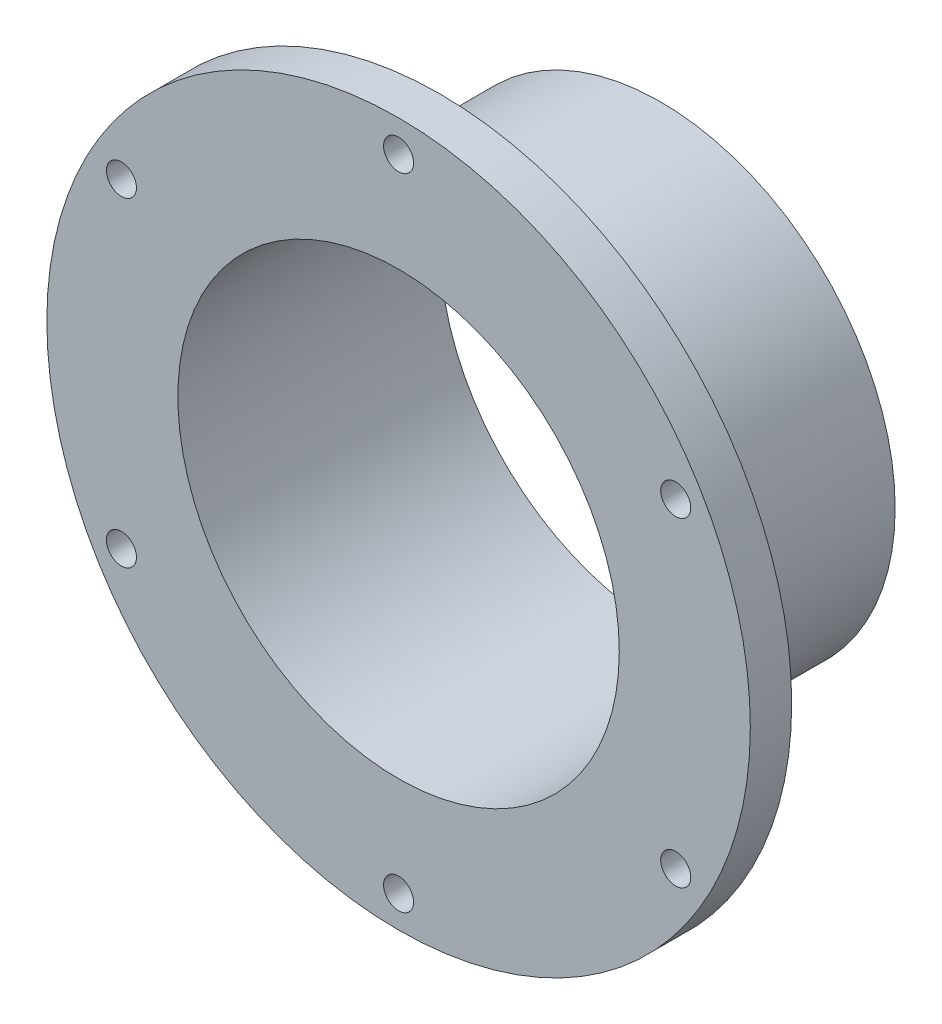
ISO-10303-21;
HEADER;
FILE_DESCRIPTION(('STEP AP214'),'2;1');
FILE_NAME('part.step','',(''),(''),'','','');
FILE_SCHEMA(('AUTOMOTIVE_DESIGN { 1 0 10303 214 1 1 1 1 }'));
ENDSEC;
DATA;
#1=APPLICATION_CONTEXT('core data for automotive mechanical design processes');
#2=APPLICATION_PROTOCOL_DEFINITION('international standard','automotive_design',2000,#1);
#3=PRODUCT_CONTEXT('',#1,'mechanical');
#4=PRODUCT('Part','Part','',(#3));
#5=PRODUCT_RELATED_PRODUCT_CATEGORY('part','',(#4));
#6=PRODUCT_DEFINITION_FORMATION('','',#4);
#7=PRODUCT_DEFINITION_CONTEXT('part definition',#1,'design');
#8=PRODUCT_DEFINITION('design','',#6,#7);
#9=PRODUCT_DEFINITION_SHAPE('','',#8);
#10=(LENGTH_UNIT() NAMED_UNIT(*) SI_UNIT(.MILLI.,.METRE.));
#11=(NAMED_UNIT(*) PLANE_ANGLE_UNIT() SI_UNIT($,.RADIAN.));
#12=(NAMED_UNIT(*) SI_UNIT($,.STERADIAN.) SOLID_ANGLE_UNIT());
#13=UNCERTAINTY_MEASURE_WITH_UNIT(LENGTH_MEASURE(1.E-05),#10,'distance_accuracy_value','');
#14=(GEOMETRIC_REPRESENTATION_CONTEXT(3) GLOBAL_UNCERTAINTY_ASSIGNED_CONTEXT((#13)) GLOBAL_UNIT_ASSIGNED_CONTEXT((#10,
#11,#12)) REPRESENTATION_CONTEXT('',''));
#15=CARTESIAN_POINT('',(0.,0.,0.));
#16=DIRECTION('',(0.,0.,1.));
#17=DIRECTION('',(1.,0.,0.));
#18=AXIS2_PLACEMENT_3D('',#15,#16,#17);
#19=CARTESIAN_POINT('',(0.,0.,0.));
#20=DIRECTION('',(0.,0.,1.));
#21=DIRECTION('',(1.,0.,0.));
#22=AXIS2_PLACEMENT_3D('',#19,#20,#21);
#23=PLANE('',#22);
#24=CARTESIAN_POINT('',(0.,0.,0.));
#25=DIRECTION('',(0.,0.,1.));
#26=DIRECTION('',(1.,0.,0.));
#27=AXIS2_PLACEMENT_3D('',#24,#25,#26);
#28=CIRCLE('',#27,26.9875);
#29=CARTESIAN_POINT('',(26.9875,0.,0.));
#30=VERTEX_POINT('',#29);
#31=EDGE_CURVE('E44',#30,#30,#28,.T.);
#32=ORIENTED_EDGE('',*,*,#31,.F.);
#33=EDGE_LOOP('',(#32));
#34=FACE_BOUND('',#33,.T.);
#35=CARTESIAN_POINT('',(0.,0.,0.));
#36=DIRECTION('',(0.,0.,1.));
#37=DIRECTION('',(1.,0.,0.));
#38=AXIS2_PLACEMENT_3D('',#35,#36,#37);
#39=CIRCLE('',#38,25.4);
#40=CARTESIAN_POINT('',(25.4,0.,0.));
#41=VERTEX_POINT('',#40);
#42=EDGE_CURVE('E48',#41,#41,#39,.T.);
#43=ORIENTED_EDGE('',*,*,#42,.T.);
#44=EDGE_LOOP('',(#43));
#45=FACE_BOUND('',#44,.T.);
#46=ADVANCED_FACE('F33',(#34,#45),#23,.F.);
#47=CARTESIAN_POINT('',(0.,0.,25.4));
#48=DIRECTION('',(0.,0.,-1.));
#49=DIRECTION('',(-1.,0.,0.));
#50=AXIS2_PLACEMENT_3D('',#47,#48,#49);
#51=CYLINDRICAL_SURFACE('',#50,26.9875);
#52=CARTESIAN_POINT('',(0.,0.,20.32));
#53=DIRECTION('',(0.,0.,1.));
#54=DIRECTION('',(1.,0.,0.));
#55=AXIS2_PLACEMENT_3D('',#52,#53,#54);
#56=CIRCLE('',#55,26.9875);
#57=CARTESIAN_POINT('',(26.9875,0.,20.32));
#58=VERTEX_POINT('',#57);
#59=EDGE_CURVE('E10',#58,#58,#56,.F.);
#60=ORIENTED_EDGE('',*,*,#59,.T.);
#61=EDGE_LOOP('',(#60));
#62=FACE_BOUND('',#61,.T.);
#63=ORIENTED_EDGE('',*,*,#31,.T.);
#64=EDGE_LOOP('',(#63));
#65=FACE_BOUND('',#64,.T.);
#66=ADVANCED_FACE('F124',(#62,#65),#51,.T.);
#67=CARTESIAN_POINT('',(0.,0.,25.4));
#68=DIRECTION('',(0.,0.,-1.));
#69=DIRECTION('',(-1.,0.,0.));
#70=AXIS2_PLACEMENT_3D('',#67,#68,#69);
#71=CYLINDRICAL_SURFACE('',#70,25.4);
#72=ORIENTED_EDGE('',*,*,#42,.F.);
#73=EDGE_LOOP('',(#72));
#74=FACE_BOUND('',#73,.T.);
#75=CARTESIAN_POINT('',(0.,0.,30.1625));
#76=DIRECTION('',(0.,0.,1.));
#77=DIRECTION('',(1.,0.,0.));
#78=AXIS2_PLACEMENT_3D('',#75,#76,#77);
#79=CIRCLE('',#78,25.4);
#80=CARTESIAN_POINT('',(25.4,0.,30.1625));
#81=VERTEX_POINT('',#80);
#82=EDGE_CURVE('E57',#81,#81,#79,.T.);
#83=ORIENTED_EDGE('',*,*,#82,.T.);
#84=EDGE_LOOP('',(#83));
#85=FACE_BOUND('',#84,.T.);
#86=ADVANCED_FACE('F122',(#74,#85),#71,.F.);
#87=CARTESIAN_POINT('',(0.,0.,25.4));
#88=DIRECTION('',(0.,0.,1.));
#89=DIRECTION('',(1.,0.,0.));
#90=AXIS2_PLACEMENT_3D('',#87,#88,#89);
#91=PLANE('',#90);
#92=CARTESIAN_POINT('',(31.8957156213807,18.4150000000004,25.4));
#93=DIRECTION('',(0.,0.,1.));
#94=DIRECTION('',(1.,0.,0.));
#95=AXIS2_PLACEMENT_3D('',#92,#93,#94);
#96=CIRCLE('',#95,1.72719999999999);
#97=CARTESIAN_POINT('',(33.6229156213806,18.4150000000004,25.4));
#98=VERTEX_POINT('',#97);
#99=EDGE_CURVE('E92',#98,#98,#96,.T.);
#100=ORIENTED_EDGE('',*,*,#99,.T.);
#101=EDGE_LOOP('',(#100));
#102=FACE_BOUND('',#101,.T.);
#103=CARTESIAN_POINT('',(31.8957156213811,-18.4149999999997,25.4));
#104=DIRECTION('',(0.,0.,1.));
#105=DIRECTION('',(1.,0.,0.));
#106=AXIS2_PLACEMENT_3D('',#103,#104,#105);
#107=CIRCLE('',#106,1.72719999999999);
#108=CARTESIAN_POINT('',(33.622915621381,-18.4149999999997,25.4));
#109=VERTEX_POINT('',#108);
#110=EDGE_CURVE('E86',#109,#109,#107,.T.);
#111=ORIENTED_EDGE('',*,*,#110,.T.);
#112=EDGE_LOOP('',(#111));
#113=FACE_BOUND('',#112,.T.);
#114=CARTESIAN_POINT('',(0.,-36.83,25.4));
#115=DIRECTION('',(0.,0.,1.));
#116=DIRECTION('',(1.,0.,0.));
#117=AXIS2_PLACEMENT_3D('',#114,#115,#116);
#118=CIRCLE('',#117,1.72719999999999);
#119=CARTESIAN_POINT('',(1.72719999999999,-36.83,25.4));
#120=VERTEX_POINT('',#119);
#121=EDGE_CURVE('E80',#120,#120,#118,.T.);
#122=ORIENTED_EDGE('',*,*,#121,.T.);
#123=EDGE_LOOP('',(#122));
#124=FACE_BOUND('',#123,.T.);
#125=CARTESIAN_POINT('',(-31.8957156213808,-18.4150000000001,25.4));
#126=DIRECTION('',(0.,0.,1.));
#127=DIRECTION('',(1.,0.,0.));
#128=AXIS2_PLACEMENT_3D('',#125,#126,#127);
#129=CIRCLE('',#128,1.72719999999999);
#130=CARTESIAN_POINT('',(-30.1685156213808,-18.4150000000001,25.4));
#131=VERTEX_POINT('',#130);
#132=EDGE_CURVE('E74',#131,#131,#129,.T.);
#133=ORIENTED_EDGE('',*,*,#132,.T.);
#134=EDGE_LOOP('',(#133));
#135=FACE_BOUND('',#134,.T.);
#136=CARTESIAN_POINT('',(-31.8957156213809,18.4149999999999,25.4));
#137=DIRECTION('',(0.,0.,1.));
#138=DIRECTION('',(1.,0.,0.));
#139=AXIS2_PLACEMENT_3D('',#136,#137,#138);
#140=CIRCLE('',#139,1.72719999999999);
#141=CARTESIAN_POINT('',(-30.1685156213809,18.4149999999999,25.4));
#142=VERTEX_POINT('',#141);
#143=EDGE_CURVE('E68',#142,#142,#140,.T.);
#144=ORIENTED_EDGE('',*,*,#143,.T.);
#145=EDGE_LOOP('',(#144));
#146=FACE_BOUND('',#145,.T.);
#147=CARTESIAN_POINT('',(0.,36.83,25.4));
#148=DIRECTION('',(0.,0.,1.));
#149=DIRECTION('',(1.,0.,0.));
#150=AXIS2_PLACEMENT_3D('',#147,#148,#149);
#151=CIRCLE('',#150,1.72719999999999);
#152=CARTESIAN_POINT('',(1.72719999999999,36.83,25.4));
#153=VERTEX_POINT('',#152);
#154=EDGE_CURVE('E62',#153,#153,#151,.T.);
#155=ORIENTED_EDGE('',*,*,#154,.T.);
#156=EDGE_LOOP('',(#155));
#157=FACE_BOUND('',#156,.T.);
#158=CARTESIAN_POINT('',(0.,0.,25.4));
#159=DIRECTION('',(0.,0.,1.));
#160=DIRECTION('',(1.,0.,0.));
#161=AXIS2_PLACEMENT_3D('',#158,#159,#160);
#162=CIRCLE('',#161,32.0675);
#163=CARTESIAN_POINT('',(32.0675,0.,25.4));
#164=VERTEX_POINT('',#163);
#165=EDGE_CURVE('E40',#164,#164,#162,.T.);
#166=ORIENTED_EDGE('',*,*,#165,.T.);
#167=EDGE_LOOP('',(#166));
#168=FACE_BOUND('',#167,.T.);
#169=CARTESIAN_POINT('',(0.,0.,25.4));
#170=DIRECTION('',(0.,0.,1.));
#171=DIRECTION('',(1.,0.,0.));
#172=AXIS2_PLACEMENT_3D('',#169,#170,#171);
#173=CIRCLE('',#172,40.48125);
#174=CARTESIAN_POINT('',(-40.48125,0.,25.4));
#175=VERTEX_POINT('',#174);
#176=EDGE_CURVE('E54',#175,#175,#173,.T.);
#177=ORIENTED_EDGE('',*,*,#176,.F.);
#178=EDGE_LOOP('',(#177));
#179=FACE_BOUND('',#178,.T.);
#180=ADVANCED_FACE('F106',(#102,#113,#124,#135,#146,#157,#168,#179),#91,.F.);
#181=CARTESIAN_POINT('',(0.,0.,30.1625));
#182=DIRECTION('',(0.,0.,1.));
#183=DIRECTION('',(1.,0.,0.));
#184=AXIS2_PLACEMENT_3D('',#181,#182,#183);
#185=PLANE('',#184);
#186=CARTESIAN_POINT('',(31.8957156213807,18.4150000000004,30.1625));
#187=DIRECTION('',(0.,0.,1.));
#188=DIRECTION('',(1.,0.,0.));
#189=AXIS2_PLACEMENT_3D('',#186,#187,#188);
#190=CIRCLE('',#189,1.72719999999999);
#191=CARTESIAN_POINT('',(33.6229156213806,18.4150000000004,30.1625));
#192=VERTEX_POINT('',#191);
#193=EDGE_CURVE('E95',#192,#192,#190,.T.);
#194=ORIENTED_EDGE('',*,*,#193,.F.);
#195=EDGE_LOOP('',(#194));
#196=FACE_BOUND('',#195,.T.);
#197=CARTESIAN_POINT('',(31.8957156213811,-18.4149999999997,30.1625));
#198=DIRECTION('',(0.,0.,1.));
#199=DIRECTION('',(1.,0.,0.));
#200=AXIS2_PLACEMENT_3D('',#197,#198,#199);
#201=CIRCLE('',#200,1.72719999999999);
#202=CARTESIAN_POINT('',(33.622915621381,-18.4149999999997,30.1625));
#203=VERTEX_POINT('',#202);
#204=EDGE_CURVE('E89',#203,#203,#201,.T.);
#205=ORIENTED_EDGE('',*,*,#204,.F.);
#206=EDGE_LOOP('',(#205));
#207=FACE_BOUND('',#206,.T.);
#208=CARTESIAN_POINT('',(0.,-36.83,30.1625));
#209=DIRECTION('',(0.,0.,1.));
#210=DIRECTION('',(1.,0.,0.));
#211=AXIS2_PLACEMENT_3D('',#208,#209,#210);
#212=CIRCLE('',#211,1.72719999999999);
#213=CARTESIAN_POINT('',(1.72719999999999,-36.83,30.1625));
#214=VERTEX_POINT('',#213);
#215=EDGE_CURVE('E83',#214,#214,#212,.T.);
#216=ORIENTED_EDGE('',*,*,#215,.F.);
#217=EDGE_LOOP('',(#216));
#218=FACE_BOUND('',#217,.T.);
#219=CARTESIAN_POINT('',(-31.8957156213808,-18.4150000000001,30.1625));
#220=DIRECTION('',(0.,0.,1.));
#221=DIRECTION('',(1.,0.,0.));
#222=AXIS2_PLACEMENT_3D('',#219,#220,#221);
#223=CIRCLE('',#222,1.72719999999999);
#224=CARTESIAN_POINT('',(-30.1685156213808,-18.4150000000001,30.1625));
#225=VERTEX_POINT('',#224);
#226=EDGE_CURVE('E77',#225,#225,#223,.T.);
#227=ORIENTED_EDGE('',*,*,#226,.F.);
#228=EDGE_LOOP('',(#227));
#229=FACE_BOUND('',#228,.T.);
#230=CARTESIAN_POINT('',(-31.8957156213809,18.4149999999999,30.1625));
#231=DIRECTION('',(0.,0.,1.));
#232=DIRECTION('',(1.,0.,0.));
#233=AXIS2_PLACEMENT_3D('',#230,#231,#232);
#234=CIRCLE('',#233,1.72719999999999);
#235=CARTESIAN_POINT('',(-30.1685156213809,18.4149999999999,30.1625));
#236=VERTEX_POINT('',#235);
#237=EDGE_CURVE('E71',#236,#236,#234,.T.);
#238=ORIENTED_EDGE('',*,*,#237,.F.);
#239=EDGE_LOOP('',(#238));
#240=FACE_BOUND('',#239,.T.);
#241=CARTESIAN_POINT('',(0.,36.83,30.1625));
#242=DIRECTION('',(0.,0.,1.));
#243=DIRECTION('',(1.,0.,0.));
#244=AXIS2_PLACEMENT_3D('',#241,#242,#243);
#245=CIRCLE('',#244,1.72719999999999);
#246=CARTESIAN_POINT('',(1.72719999999999,36.83,30.1625));
#247=VERTEX_POINT('',#246);
#248=EDGE_CURVE('E65',#247,#247,#245,.T.);
#249=ORIENTED_EDGE('',*,*,#248,.F.);
#250=EDGE_LOOP('',(#249));
#251=FACE_BOUND('',#250,.T.);
#252=CARTESIAN_POINT('',(0.,0.,30.1625));
#253=DIRECTION('',(0.,0.,1.));
#254=DIRECTION('',(1.,0.,0.));
#255=AXIS2_PLACEMENT_3D('',#252,#253,#254);
#256=CIRCLE('',#255,40.48125);
#257=CARTESIAN_POINT('',(-40.48125,0.,30.1625));
#258=VERTEX_POINT('',#257);
#259=EDGE_CURVE('E53',#258,#258,#256,.T.);
#260=ORIENTED_EDGE('',*,*,#259,.T.);
#261=EDGE_LOOP('',(#260));
#262=FACE_BOUND('',#261,.T.);
#263=ORIENTED_EDGE('',*,*,#82,.F.);
#264=EDGE_LOOP('',(#263));
#265=FACE_BOUND('',#264,.T.);
#266=ADVANCED_FACE('F102',(#196,#207,#218,#229,#240,#251,#262,#265),#185,.T.);
#267=CARTESIAN_POINT('',(0.,0.,30.1625));
#268=DIRECTION('',(0.,0.,-1.));
#269=DIRECTION('',(-1.,0.,0.));
#270=AXIS2_PLACEMENT_3D('',#267,#268,#269);
#271=CYLINDRICAL_SURFACE('',#270,40.48125);
#272=CARTESIAN_POINT('',(-40.48125,0.,30.1625));
#273=CARTESIAN_POINT('',(-40.48125,0.,30.112890625));
#274=CARTESIAN_POINT('',(-40.48125,0.,30.06328125));
#275=CARTESIAN_POINT('',(-40.48125,0.,29.9640625));
#276=CARTESIAN_POINT('',(-40.48125,0.,29.914453125));
#277=CARTESIAN_POINT('',(-40.48125,0.,29.815234375));
#278=CARTESIAN_POINT('',(-40.48125,0.,29.765625));
#279=CARTESIAN_POINT('',(-40.48125,0.,29.66640625));
#280=CARTESIAN_POINT('',(-40.48125,0.,29.616796875));
#281=CARTESIAN_POINT('',(-40.48125,0.,29.517578125));
#282=CARTESIAN_POINT('',(-40.48125,0.,29.46796875));
#283=CARTESIAN_POINT('',(-40.48125,0.,29.36875));
#284=CARTESIAN_POINT('',(-40.48125,0.,29.319140625));
#285=CARTESIAN_POINT('',(-40.48125,0.,29.219921875));
#286=CARTESIAN_POINT('',(-40.48125,0.,29.1703125));
#287=CARTESIAN_POINT('',(-40.48125,0.,29.07109375));
#288=CARTESIAN_POINT('',(-40.48125,0.,29.021484375));
#289=CARTESIAN_POINT('',(-40.48125,0.,28.922265625));
#290=CARTESIAN_POINT('',(-40.48125,0.,28.87265625));
#291=CARTESIAN_POINT('',(-40.48125,0.,28.7734375));
#292=CARTESIAN_POINT('',(-40.48125,0.,28.723828125));
#293=CARTESIAN_POINT('',(-40.48125,0.,28.624609375));
#294=CARTESIAN_POINT('',(-40.48125,0.,28.575));
#295=CARTESIAN_POINT('',(-40.48125,0.,28.47578125));
#296=CARTESIAN_POINT('',(-40.48125,0.,28.426171875));
#297=CARTESIAN_POINT('',(-40.48125,0.,28.326953125));
#298=CARTESIAN_POINT('',(-40.48125,0.,28.27734375));
#299=CARTESIAN_POINT('',(-40.48125,0.,28.178125));
#300=CARTESIAN_POINT('',(-40.48125,0.,28.128515625));
#301=CARTESIAN_POINT('',(-40.48125,0.,28.029296875));
#302=CARTESIAN_POINT('',(-40.48125,0.,27.9796875));
#303=CARTESIAN_POINT('',(-40.48125,0.,27.88046875));
#304=CARTESIAN_POINT('',(-40.48125,0.,27.830859375));
#305=CARTESIAN_POINT('',(-40.48125,0.,27.731640625));
#306=CARTESIAN_POINT('',(-40.48125,0.,27.68203125));
#307=CARTESIAN_POINT('',(-40.48125,0.,27.5828125));
#308=CARTESIAN_POINT('',(-40.48125,0.,27.533203125));
#309=CARTESIAN_POINT('',(-40.48125,0.,27.433984375));
#310=CARTESIAN_POINT('',(-40.48125,0.,27.384375));
#311=CARTESIAN_POINT('',(-40.48125,0.,27.28515625));
#312=CARTESIAN_POINT('',(-40.48125,0.,27.235546875));
#313=CARTESIAN_POINT('',(-40.48125,0.,27.136328125));
#314=CARTESIAN_POINT('',(-40.48125,0.,27.08671875));
#315=CARTESIAN_POINT('',(-40.48125,0.,26.9875));
#316=CARTESIAN_POINT('',(-40.48125,0.,26.937890625));
#317=CARTESIAN_POINT('',(-40.48125,0.,26.838671875));
#318=CARTESIAN_POINT('',(-40.48125,0.,26.7890625));
#319=CARTESIAN_POINT('',(-40.48125,0.,26.68984375));
#320=CARTESIAN_POINT('',(-40.48125,0.,26.640234375));
#321=CARTESIAN_POINT('',(-40.48125,0.,26.541015625));
#322=CARTESIAN_POINT('',(-40.48125,0.,26.49140625));
#323=CARTESIAN_POINT('',(-40.48125,0.,26.3921875));
#324=CARTESIAN_POINT('',(-40.48125,0.,26.342578125));
#325=CARTESIAN_POINT('',(-40.48125,0.,26.243359375));
#326=CARTESIAN_POINT('',(-40.48125,0.,26.19375));
#327=CARTESIAN_POINT('',(-40.48125,0.,26.09453125));
#328=CARTESIAN_POINT('',(-40.48125,0.,26.044921875));
#329=CARTESIAN_POINT('',(-40.48125,0.,25.945703125));
#330=CARTESIAN_POINT('',(-40.48125,0.,25.89609375));
#331=CARTESIAN_POINT('',(-40.48125,0.,25.796875));
#332=CARTESIAN_POINT('',(-40.48125,0.,25.747265625));
#333=CARTESIAN_POINT('',(-40.48125,0.,25.648046875));
#334=CARTESIAN_POINT('',(-40.48125,0.,25.5984375));
#335=CARTESIAN_POINT('',(-40.48125,0.,25.49921875));
#336=CARTESIAN_POINT('',(-40.48125,0.,25.449609375));
#337=CARTESIAN_POINT('',(-40.48125,0.,25.4));
#338=B_SPLINE_CURVE_WITH_KNOTS('',3,(#272,#273,#274,#275,#276,#277,#278,#279,#280,#281,#282,
#283,#284,#285,#286,#287,#288,#289,#290,#291,#292,#293,#294,#295,#296,#297,#298,#299,#300,#301,
#302,#303,#304,#305,#306,#307,#308,#309,#310,#311,#312,#313,#314,#315,#316,#317,#318,#319,#320,
#321,#322,#323,#324,#325,#326,#327,#328,#329,#330,#331,#332,#333,#334,#335,#336,#337),
.UNSPECIFIED.,.F.,.F.,(4,2,2,2,2,2,2,2,2,2,2,2,2,2,2,2,2,2,2,2,2,2,2,2,2,2,2,2,2,2,2,2,4),(0.,
0.148828125,0.29765625,0.446484375,0.5953125,0.744140625,0.892968750000001,1.041796875,1.190625,
1.339453125,1.48828125,1.637109375,1.7859375,1.934765625,2.08359375,2.232421875,2.38125,
2.530078125,2.67890625,2.827734375,2.9765625,3.125390625,3.27421875,3.423046875,3.571875,
3.720703125,3.86953125,4.018359375,4.1671875,4.316015625,4.46484375,4.613671875,4.7625),.UNSPECIFIED.);
#339=EDGE_CURVE('BSEAM105',#258,#175,#338,.T.);
#340=ORIENTED_EDGE('',*,*,#259,.F.);
#341=ORIENTED_EDGE('',*,*,#176,.T.);
#342=ORIENTED_EDGE('',*,*,#339,.T.);
#343=ORIENTED_EDGE('',*,*,#339,.F.);
#344=EDGE_LOOP('',(#340,#342,#341,#343));
#345=FACE_BOUND('',#344,.T.);
#346=ADVANCED_FACE('F105',(#345),#271,.T.);
#347=CARTESIAN_POINT('',(0.,0.,20.32));
#348=DIRECTION('',(0.,0.,1.));
#349=DIRECTION('',(1.,0.,0.));
#350=AXIS2_PLACEMENT_3D('',#347,#348,#349);
#351=TOROIDAL_SURFACE('',#350,32.0675,5.08);
#352=ORIENTED_EDGE('',*,*,#59,.F.);
#353=EDGE_LOOP('',(#352));
#354=FACE_BOUND('',#353,.T.);
#355=ORIENTED_EDGE('',*,*,#165,.F.);
#356=EDGE_LOOP('',(#355));
#357=FACE_BOUND('',#356,.T.);
#358=ADVANCED_FACE('F35',(#354,#357),#351,.F.);
#359=CARTESIAN_POINT('',(0.,36.83,30.1625));
#360=DIRECTION('',(0.,0.,1.));
#361=DIRECTION('',(1.,0.,0.));
#362=AXIS2_PLACEMENT_3D('',#359,#360,#361);
#363=CYLINDRICAL_SURFACE('',#362,1.72719999999999);
#364=ORIENTED_EDGE('',*,*,#248,.T.);
#365=EDGE_LOOP('',(#364));
#366=FACE_BOUND('',#365,.T.);
#367=ORIENTED_EDGE('',*,*,#154,.F.);
#368=EDGE_LOOP('',(#367));
#369=FACE_BOUND('',#368,.T.);
#370=ADVANCED_FACE('F161',(#366,#369),#363,.F.);
#371=CARTESIAN_POINT('',(-31.8957156213809,18.4149999999999,30.1625));
#372=DIRECTION('',(0.,0.,1.));
#373=DIRECTION('',(1.,0.,0.));
#374=AXIS2_PLACEMENT_3D('',#371,#372,#373);
#375=CYLINDRICAL_SURFACE('',#374,1.72719999999999);
#376=ORIENTED_EDGE('',*,*,#237,.T.);
#377=EDGE_LOOP('',(#376));
#378=FACE_BOUND('',#377,.T.);
#379=ORIENTED_EDGE('',*,*,#143,.F.);
#380=EDGE_LOOP('',(#379));
#381=FACE_BOUND('',#380,.T.);
#382=ADVANCED_FACE('F171',(#378,#381),#375,.F.);
#383=CARTESIAN_POINT('',(-31.8957156213808,-18.4150000000001,30.1625));
#384=DIRECTION('',(0.,0.,1.));
#385=DIRECTION('',(1.,0.,0.));
#386=AXIS2_PLACEMENT_3D('',#383,#384,#385);
#387=CYLINDRICAL_SURFACE('',#386,1.72719999999999);
#388=ORIENTED_EDGE('',*,*,#226,.T.);
#389=EDGE_LOOP('',(#388));
#390=FACE_BOUND('',#389,.T.);
#391=ORIENTED_EDGE('',*,*,#132,.F.);
#392=EDGE_LOOP('',(#391));
#393=FACE_BOUND('',#392,.T.);
#394=ADVANCED_FACE('F196',(#390,#393),#387,.F.);
#395=CARTESIAN_POINT('',(0.,-36.83,30.1625));
#396=DIRECTION('',(0.,0.,1.));
#397=DIRECTION('',(1.,0.,0.));
#398=AXIS2_PLACEMENT_3D('',#395,#396,#397);
#399=CYLINDRICAL_SURFACE('',#398,1.72719999999999);
#400=ORIENTED_EDGE('',*,*,#215,.T.);
#401=EDGE_LOOP('',(#400));
#402=FACE_BOUND('',#401,.T.);
#403=ORIENTED_EDGE('',*,*,#121,.F.);
#404=EDGE_LOOP('',(#403));
#405=FACE_BOUND('',#404,.T.);
#406=ADVANCED_FACE('F207',(#402,#405),#399,.F.);
#407=CARTESIAN_POINT('',(31.8957156213811,-18.4149999999997,30.1625));
#408=DIRECTION('',(0.,0.,1.));
#409=DIRECTION('',(1.,0.,0.));
#410=AXIS2_PLACEMENT_3D('',#407,#408,#409);
#411=CYLINDRICAL_SURFACE('',#410,1.72719999999999);
#412=ORIENTED_EDGE('',*,*,#204,.T.);
#413=EDGE_LOOP('',(#412));
#414=FACE_BOUND('',#413,.T.);
#415=ORIENTED_EDGE('',*,*,#110,.F.);
#416=EDGE_LOOP('',(#415));
#417=FACE_BOUND('',#416,.T.);
#418=ADVANCED_FACE('F218',(#414,#417),#411,.F.);
#419=CARTESIAN_POINT('',(31.8957156213807,18.4150000000004,30.1625));
#420=DIRECTION('',(0.,0.,1.));
#421=DIRECTION('',(1.,0.,0.));
#422=AXIS2_PLACEMENT_3D('',#419,#420,#421);
#423=CYLINDRICAL_SURFACE('',#422,1.72719999999999);
#424=ORIENTED_EDGE('',*,*,#193,.T.);
#425=EDGE_LOOP('',(#424));
#426=FACE_BOUND('',#425,.T.);
#427=ORIENTED_EDGE('',*,*,#99,.F.);
#428=EDGE_LOOP('',(#427));
#429=FACE_BOUND('',#428,.T.);
#430=ADVANCED_FACE('F99',(#426,#429),#423,.F.);
#431=CLOSED_SHELL('',(#46,#66,#86,#180,#266,#346,#358,#370,#382,#394,#406,#418,#430));
#432=MANIFOLD_SOLID_BREP('B2',#431);
#433=ADVANCED_BREP_SHAPE_REPRESENTATION('',(#18,#432),#14);
#434=SHAPE_DEFINITION_REPRESENTATION(#9,#433);
ENDSEC;
END-ISO-10303-21;
